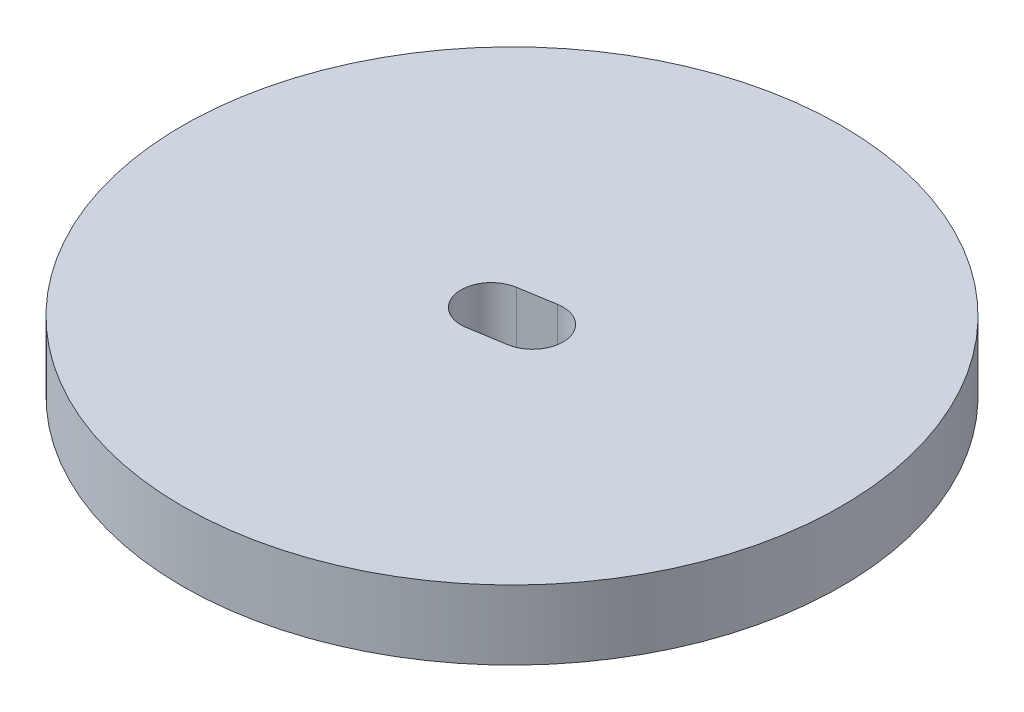
ISO-10303-21;
HEADER;
FILE_DESCRIPTION(('STEP AP214'),'2;1');
FILE_NAME('part.step','',(''),(''),'','','');
FILE_SCHEMA(('AUTOMOTIVE_DESIGN { 1 0 10303 214 1 1 1 1 }'));
ENDSEC;
DATA;
#1=APPLICATION_CONTEXT('core data for automotive mechanical design processes');
#2=APPLICATION_PROTOCOL_DEFINITION('international standard','automotive_design',2000,#1);
#3=PRODUCT_CONTEXT('',#1,'mechanical');
#4=PRODUCT('Part','Part','',(#3));
#5=PRODUCT_RELATED_PRODUCT_CATEGORY('part','',(#4));
#6=PRODUCT_DEFINITION_FORMATION('','',#4);
#7=PRODUCT_DEFINITION_CONTEXT('part definition',#1,'design');
#8=PRODUCT_DEFINITION('design','',#6,#7);
#9=PRODUCT_DEFINITION_SHAPE('','',#8);
#10=(LENGTH_UNIT() NAMED_UNIT(*) SI_UNIT(.MILLI.,.METRE.));
#11=(NAMED_UNIT(*) PLANE_ANGLE_UNIT() SI_UNIT($,.RADIAN.));
#12=(NAMED_UNIT(*) SI_UNIT($,.STERADIAN.) SOLID_ANGLE_UNIT());
#13=UNCERTAINTY_MEASURE_WITH_UNIT(LENGTH_MEASURE(1.E-05),#10,'distance_accuracy_value','');
#14=(GEOMETRIC_REPRESENTATION_CONTEXT(3) GLOBAL_UNCERTAINTY_ASSIGNED_CONTEXT((#13)) GLOBAL_UNIT_ASSIGNED_CONTEXT((#10,
#11,#12)) REPRESENTATION_CONTEXT('',''));
#15=CARTESIAN_POINT('',(0.,0.,0.));
#16=DIRECTION('',(0.,0.,1.));
#17=DIRECTION('',(1.,0.,0.));
#18=AXIS2_PLACEMENT_3D('',#15,#16,#17);
#19=CARTESIAN_POINT('',(0.,4.,0.));
#20=DIRECTION('',(0.,-1.,0.));
#21=DIRECTION('',(0.,0.,-1.));
#22=AXIS2_PLACEMENT_3D('',#19,#20,#21);
#23=CYLINDRICAL_SURFACE('',#22,19.);
#24=CARTESIAN_POINT('',(0.,4.,0.));
#25=DIRECTION('',(0.,1.,0.));
#26=DIRECTION('',(0.,0.,1.));
#27=AXIS2_PLACEMENT_3D('',#24,#25,#26);
#28=CIRCLE('',#27,19.);
#29=CARTESIAN_POINT('',(0.,4.,19.));
#30=VERTEX_POINT('',#29);
#31=EDGE_CURVE('E11',#30,#30,#28,.T.);
#32=ORIENTED_EDGE('',*,*,#31,.F.);
#33=EDGE_LOOP('',(#32));
#34=FACE_BOUND('',#33,.T.);
#35=CARTESIAN_POINT('',(0.,0.,0.));
#36=DIRECTION('',(0.,1.,0.));
#37=DIRECTION('',(0.,0.,1.));
#38=AXIS2_PLACEMENT_3D('',#35,#36,#37);
#39=CIRCLE('',#38,19.);
#40=CARTESIAN_POINT('',(0.,0.,19.));
#41=VERTEX_POINT('',#40);
#42=EDGE_CURVE('E42',#41,#41,#39,.T.);
#43=ORIENTED_EDGE('',*,*,#42,.T.);
#44=EDGE_LOOP('',(#43));
#45=FACE_BOUND('',#44,.T.);
#46=ADVANCED_FACE('F39',(#34,#45),#23,.T.);
#47=CARTESIAN_POINT('',(0.,4.,0.));
#48=DIRECTION('',(0.,1.,0.));
#49=DIRECTION('',(0.,0.,1.));
#50=AXIS2_PLACEMENT_3D('',#47,#48,#49);
#51=PLANE('',#50);
#52=CARTESIAN_POINT('',(-1.02314911883353,4.,0.168090961920358));
#53=DIRECTION('',(0.,1.,0.));
#54=DIRECTION('',(0.,0.,1.));
#55=AXIS2_PLACEMENT_3D('',#52,#53,#54);
#56=CIRCLE('',#55,1.75);
#57=CARTESIAN_POINT('',(-1.30684972548529,4.,-1.55875991924611));
#58=VERTEX_POINT('',#57);
#59=CARTESIAN_POINT('',(-0.739448512181764,4.,1.89494184308683));
#60=VERTEX_POINT('',#59);
#61=EDGE_CURVE('E53',#58,#60,#56,.T.);
#62=ORIENTED_EDGE('',*,*,#61,.F.);
#63=DIRECTION('',(-0.986771932095127,0.,0.162114632372437));
#64=VECTOR('',#63,1.);
#65=CARTESIAN_POINT('',(-1.30684972548529,4.,-1.55875991924611));
#66=LINE('',#65,#64);
#67=CARTESIAN_POINT('',(0.739448512181764,4.,-1.89494184308683));
#68=VERTEX_POINT('',#67);
#69=EDGE_CURVE('E97',#68,#58,#66,.T.);
#70=ORIENTED_EDGE('',*,*,#69,.F.);
#71=CARTESIAN_POINT('',(1.02314911883353,4.,-0.168090961920357));
#72=DIRECTION('',(0.,1.,0.));
#73=DIRECTION('',(0.,0.,1.));
#74=AXIS2_PLACEMENT_3D('',#71,#72,#73);
#75=CIRCLE('',#74,1.75);
#76=CARTESIAN_POINT('',(1.30684972548529,4.,1.55875991924611));
#77=VERTEX_POINT('',#76);
#78=EDGE_CURVE('E100',#77,#68,#75,.T.);
#79=ORIENTED_EDGE('',*,*,#78,.F.);
#80=DIRECTION('',(0.986771932095127,0.,-0.162114632372437));
#81=VECTOR('',#80,1.);
#82=CARTESIAN_POINT('',(-0.739448512181764,4.,1.89494184308683));
#83=LINE('',#82,#81);
#84=EDGE_CURVE('E106',#60,#77,#83,.T.);
#85=ORIENTED_EDGE('',*,*,#84,.F.);
#86=EDGE_LOOP('',(#62,#70,#79,#85));
#87=FACE_BOUND('',#86,.T.);
#88=ORIENTED_EDGE('',*,*,#31,.T.);
#89=EDGE_LOOP('',(#88));
#90=FACE_BOUND('',#89,.T.);
#91=ADVANCED_FACE('F118',(#87,#90),#51,.T.);
#92=CARTESIAN_POINT('',(0.,0.,0.));
#93=DIRECTION('',(0.,1.,0.));
#94=DIRECTION('',(0.,0.,1.));
#95=AXIS2_PLACEMENT_3D('',#92,#93,#94);
#96=PLANE('',#95);
#97=DIRECTION('',(-0.986771932095127,0.,0.162114632372437));
#98=VECTOR('',#97,1.);
#99=CARTESIAN_POINT('',(-1.30684972548529,0.,-1.55875991924611));
#100=LINE('',#99,#98);
#101=CARTESIAN_POINT('',(0.739448512181764,0.,-1.89494184308683));
#102=VERTEX_POINT('',#101);
#103=CARTESIAN_POINT('',(-1.30684972548529,0.,-1.55875991924611));
#104=VERTEX_POINT('',#103);
#105=EDGE_CURVE('E87',#102,#104,#100,.T.);
#106=ORIENTED_EDGE('',*,*,#105,.T.);
#107=CARTESIAN_POINT('',(-1.02314911883353,0.,0.168090961920358));
#108=DIRECTION('',(0.,1.,0.));
#109=DIRECTION('',(0.,0.,1.));
#110=AXIS2_PLACEMENT_3D('',#107,#108,#109);
#111=CIRCLE('',#110,1.75);
#112=CARTESIAN_POINT('',(-0.739448512181764,0.,1.89494184308683));
#113=VERTEX_POINT('',#112);
#114=EDGE_CURVE('E81',#104,#113,#111,.T.);
#115=ORIENTED_EDGE('',*,*,#114,.T.);
#116=DIRECTION('',(0.986771932095127,0.,-0.162114632372437));
#117=VECTOR('',#116,1.);
#118=CARTESIAN_POINT('',(-0.739448512181764,0.,1.89494184308683));
#119=LINE('',#118,#117);
#120=CARTESIAN_POINT('',(1.30684972548529,0.,1.55875991924611));
#121=VERTEX_POINT('',#120);
#122=EDGE_CURVE('E90',#113,#121,#119,.T.);
#123=ORIENTED_EDGE('',*,*,#122,.T.);
#124=CARTESIAN_POINT('',(1.02314911883353,0.,-0.168090961920357));
#125=DIRECTION('',(0.,1.,0.));
#126=DIRECTION('',(0.,0.,1.));
#127=AXIS2_PLACEMENT_3D('',#124,#125,#126);
#128=CIRCLE('',#127,1.75);
#129=EDGE_CURVE('E61',#121,#102,#128,.T.);
#130=ORIENTED_EDGE('',*,*,#129,.T.);
#131=EDGE_LOOP('',(#106,#115,#123,#130));
#132=FACE_BOUND('',#131,.T.);
#133=ORIENTED_EDGE('',*,*,#42,.F.);
#134=EDGE_LOOP('',(#133));
#135=FACE_BOUND('',#134,.T.);
#136=ADVANCED_FACE('F94',(#132,#135),#96,.F.);
#137=CARTESIAN_POINT('',(-1.02314911883353,0.,0.168090961920358));
#138=DIRECTION('',(0.,1.,0.));
#139=DIRECTION('',(0.,0.,1.));
#140=AXIS2_PLACEMENT_3D('',#137,#138,#139);
#141=CYLINDRICAL_SURFACE('',#140,1.75);
#142=ORIENTED_EDGE('',*,*,#61,.T.);
#143=DIRECTION('',(0.,1.,0.));
#144=VECTOR('',#143,1.);
#145=CARTESIAN_POINT('',(-0.739448512181764,0.,1.89494184308683));
#146=LINE('',#145,#144);
#147=EDGE_CURVE('E77',#113,#60,#146,.T.);
#148=ORIENTED_EDGE('',*,*,#147,.F.);
#149=ORIENTED_EDGE('',*,*,#114,.F.);
#150=DIRECTION('',(0.,1.,0.));
#151=VECTOR('',#150,1.);
#152=CARTESIAN_POINT('',(-1.30684972548529,0.,-1.55875991924611));
#153=LINE('',#152,#151);
#154=EDGE_CURVE('E110',#104,#58,#153,.T.);
#155=ORIENTED_EDGE('',*,*,#154,.T.);
#156=EDGE_LOOP('',(#142,#148,#149,#155));
#157=FACE_BOUND('',#156,.T.);
#158=ADVANCED_FACE('F79',(#157),#141,.F.);
#159=CARTESIAN_POINT('',(-1.30684972548529,0.,-1.55875991924611));
#160=DIRECTION('',(-0.162114632372437,0.,-0.986771932095127));
#161=DIRECTION('',(-0.986771932095127,0.,0.162114632372437));
#162=AXIS2_PLACEMENT_3D('',#159,#160,#161);
#163=PLANE('',#162);
#164=ORIENTED_EDGE('',*,*,#69,.T.);
#165=ORIENTED_EDGE('',*,*,#154,.F.);
#166=ORIENTED_EDGE('',*,*,#105,.F.);
#167=DIRECTION('',(0.,1.,0.));
#168=VECTOR('',#167,1.);
#169=CARTESIAN_POINT('',(0.739448512181764,0.,-1.89494184308683));
#170=LINE('',#169,#168);
#171=EDGE_CURVE('E112',#102,#68,#170,.T.);
#172=ORIENTED_EDGE('',*,*,#171,.T.);
#173=EDGE_LOOP('',(#164,#165,#166,#172));
#174=FACE_BOUND('',#173,.T.);
#175=ADVANCED_FACE('F121',(#174),#163,.F.);
#176=CARTESIAN_POINT('',(1.02314911883353,0.,-0.168090961920357));
#177=DIRECTION('',(0.,1.,0.));
#178=DIRECTION('',(0.,0.,1.));
#179=AXIS2_PLACEMENT_3D('',#176,#177,#178);
#180=CYLINDRICAL_SURFACE('',#179,1.75);
#181=ORIENTED_EDGE('',*,*,#78,.T.);
#182=ORIENTED_EDGE('',*,*,#171,.F.);
#183=ORIENTED_EDGE('',*,*,#129,.F.);
#184=DIRECTION('',(0.,1.,0.));
#185=VECTOR('',#184,1.);
#186=CARTESIAN_POINT('',(1.30684972548529,0.,1.55875991924611));
#187=LINE('',#186,#185);
#188=EDGE_CURVE('E86',#121,#77,#187,.T.);
#189=ORIENTED_EDGE('',*,*,#188,.T.);
#190=EDGE_LOOP('',(#181,#182,#183,#189));
#191=FACE_BOUND('',#190,.T.);
#192=ADVANCED_FACE('F114',(#191),#180,.F.);
#193=CARTESIAN_POINT('',(-0.739448512181764,0.,1.89494184308683));
#194=DIRECTION('',(0.162114632372437,0.,0.986771932095127));
#195=DIRECTION('',(0.986771932095127,0.,-0.162114632372437));
#196=AXIS2_PLACEMENT_3D('',#193,#194,#195);
#197=PLANE('',#196);
#198=ORIENTED_EDGE('',*,*,#84,.T.);
#199=ORIENTED_EDGE('',*,*,#188,.F.);
#200=ORIENTED_EDGE('',*,*,#122,.F.);
#201=ORIENTED_EDGE('',*,*,#147,.T.);
#202=EDGE_LOOP('',(#198,#199,#200,#201));
#203=FACE_BOUND('',#202,.T.);
#204=ADVANCED_FACE('F91',(#203),#197,.F.);
#205=CLOSED_SHELL('',(#46,#91,#136,#158,#175,#192,#204));
#206=MANIFOLD_SOLID_BREP('B2',#205);
#207=ADVANCED_BREP_SHAPE_REPRESENTATION('',(#18,#206),#14);
#208=SHAPE_DEFINITION_REPRESENTATION(#9,#207);
ENDSEC;
END-ISO-10303-21;
